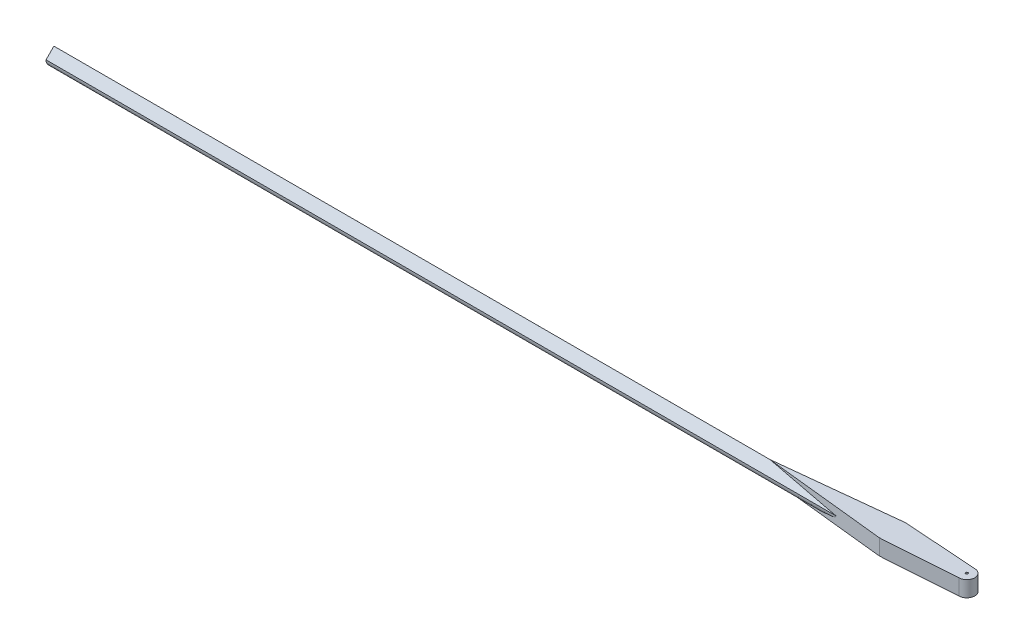
ISO-10303-21;
HEADER;
FILE_DESCRIPTION(('STEP AP214'),'2;1');
FILE_NAME('part.step','',(''),(''),'','','');
FILE_SCHEMA(('AUTOMOTIVE_DESIGN { 1 0 10303 214 1 1 1 1 }'));
ENDSEC;
DATA;
#1=APPLICATION_CONTEXT('core data for automotive mechanical design processes');
#2=APPLICATION_PROTOCOL_DEFINITION('international standard','automotive_design',2000,#1);
#3=PRODUCT_CONTEXT('',#1,'mechanical');
#4=PRODUCT('Part','Part','',(#3));
#5=PRODUCT_RELATED_PRODUCT_CATEGORY('part','',(#4));
#6=PRODUCT_DEFINITION_FORMATION('','',#4);
#7=PRODUCT_DEFINITION_CONTEXT('part definition',#1,'design');
#8=PRODUCT_DEFINITION('design','',#6,#7);
#9=PRODUCT_DEFINITION_SHAPE('','',#8);
#10=(LENGTH_UNIT() NAMED_UNIT(*) SI_UNIT(.MILLI.,.METRE.));
#11=(NAMED_UNIT(*) PLANE_ANGLE_UNIT() SI_UNIT($,.RADIAN.));
#12=(NAMED_UNIT(*) SI_UNIT($,.STERADIAN.) SOLID_ANGLE_UNIT());
#13=UNCERTAINTY_MEASURE_WITH_UNIT(LENGTH_MEASURE(1.E-05),#10,'distance_accuracy_value','');
#14=(GEOMETRIC_REPRESENTATION_CONTEXT(3) GLOBAL_UNCERTAINTY_ASSIGNED_CONTEXT((#13)) GLOBAL_UNIT_ASSIGNED_CONTEXT((#10,
#11,#12)) REPRESENTATION_CONTEXT('',''));
#15=CARTESIAN_POINT('',(0.,0.,0.));
#16=DIRECTION('',(0.,0.,1.));
#17=DIRECTION('',(1.,0.,0.));
#18=AXIS2_PLACEMENT_3D('',#15,#16,#17);
#19=CARTESIAN_POINT('',(655.434048607067,10.,0.));
#20=DIRECTION('',(0.,-1.,0.));
#21=DIRECTION('',(0.,0.,-1.));
#22=AXIS2_PLACEMENT_3D('',#19,#20,#21);
#23=PLANE('',#22);
#24=DIRECTION('',(-0.994357217076974,0.,0.10608357482163));
#25=VECTOR('',#24,1.);
#26=CARTESIAN_POINT('',(500.000000000001,10.,-10.001696369637));
#27=LINE('',#26,#25);
#28=CARTESIAN_POINT('',(561.410175265687,10.,-16.5532764363631));
#29=VERTEX_POINT('',#28);
#30=CARTESIAN_POINT('',(406.266618677878,10.,-0.00169636963684265));
#31=VERTEX_POINT('',#30);
#32=EDGE_CURVE('E244',#29,#31,#27,.T.);
#33=ORIENTED_EDGE('',*,*,#32,.T.);
#34=DIRECTION('',(-1.,0.,0.));
#35=VECTOR('',#34,1.);
#36=CARTESIAN_POINT('',(655.434048607067,10.,-0.00169636963684439));
#37=LINE('',#36,#35);
#38=CARTESIAN_POINT('',(-499.999999999999,10.,-0.00169636963684439));
#39=VERTEX_POINT('',#38);
#40=EDGE_CURVE('E150',#31,#39,#37,.T.);
#41=ORIENTED_EDGE('',*,*,#40,.T.);
#42=DIRECTION('',(0.,0.,1.));
#43=VECTOR('',#42,1.);
#44=CARTESIAN_POINT('',(-499.999999999999,10.,-10.001696369637));
#45=LINE('',#44,#43);
#46=CARTESIAN_POINT('',(-499.999999999999,10.,0.00169636963684439));
#47=VERTEX_POINT('',#46);
#48=EDGE_CURVE('E217',#39,#47,#45,.T.);
#49=ORIENTED_EDGE('',*,*,#48,.T.);
#50=DIRECTION('',(1.,0.,0.));
#51=VECTOR('',#50,1.);
#52=CARTESIAN_POINT('',(655.434048607067,10.,0.00169636963684439));
#53=LINE('',#52,#51);
#54=CARTESIAN_POINT('',(406.266618677878,10.,0.00169636963684265));
#55=VERTEX_POINT('',#54);
#56=EDGE_CURVE('E137',#47,#55,#53,.T.);
#57=ORIENTED_EDGE('',*,*,#56,.T.);
#58=DIRECTION('',(0.994357217076974,0.,0.10608357482163));
#59=VECTOR('',#58,1.);
#60=CARTESIAN_POINT('',(500.000000000001,10.,10.001696369637));
#61=LINE('',#60,#59);
#62=CARTESIAN_POINT('',(561.410175265687,10.,16.5532764363631));
#63=VERTEX_POINT('',#62);
#64=EDGE_CURVE('E131',#55,#63,#61,.T.);
#65=ORIENTED_EDGE('',*,*,#64,.T.);
#66=DIRECTION('',(0.997581155940313,0.,-0.0695114185784537));
#67=VECTOR('',#66,1.);
#68=CARTESIAN_POINT('',(561.410175265687,10.,16.5532764363631));
#69=LINE('',#68,#67);
#70=CARTESIAN_POINT('',(655.434048607067,10.,10.001696369637));
#71=VERTEX_POINT('',#70);
#72=EDGE_CURVE('E120',#63,#71,#69,.T.);
#73=ORIENTED_EDGE('',*,*,#72,.T.);
#74=CARTESIAN_POINT('',(655.434048607067,10.,0.));
#75=DIRECTION('',(0.,1.,0.));
#76=DIRECTION('',(0.,0.,-1.));
#77=AXIS2_PLACEMENT_3D('',#74,#75,#76);
#78=CIRCLE('',#77,10.001696369637);
#79=CARTESIAN_POINT('',(655.434048607067,10.,-10.001696369637));
#80=VERTEX_POINT('',#79);
#81=EDGE_CURVE('E130',#71,#80,#78,.T.);
#82=ORIENTED_EDGE('',*,*,#81,.T.);
#83=DIRECTION('',(-0.997581155940313,0.,-0.0695114185784537));
#84=VECTOR('',#83,1.);
#85=CARTESIAN_POINT('',(561.410175265687,10.,-16.5532764363631));
#86=LINE('',#85,#84);
#87=EDGE_CURVE('E227',#80,#29,#86,.T.);
#88=ORIENTED_EDGE('',*,*,#87,.T.);
#89=EDGE_LOOP('',(#33,#41,#49,#57,#65,#73,#82,#88));
#90=FACE_BOUND('',#89,.T.);
#91=CARTESIAN_POINT('',(655.434048607067,10.,0.));
#92=DIRECTION('',(0.,1.,0.));
#93=DIRECTION('',(0.,0.,1.));
#94=AXIS2_PLACEMENT_3D('',#91,#92,#93);
#95=CIRCLE('',#94,1.49999999999997);
#96=CARTESIAN_POINT('',(655.434048607067,10.,1.49999999999997));
#97=VERTEX_POINT('',#96);
#98=EDGE_CURVE('E241',#97,#97,#95,.T.);
#99=ORIENTED_EDGE('',*,*,#98,.F.);
#100=EDGE_LOOP('',(#99));
#101=FACE_BOUND('',#100,.T.);
#102=ADVANCED_FACE('F42',(#90,#101),#23,.F.);
#103=CARTESIAN_POINT('',(655.434048607067,-10.,0.));
#104=DIRECTION('',(0.,-1.,0.));
#105=DIRECTION('',(0.,0.,-1.));
#106=AXIS2_PLACEMENT_3D('',#103,#104,#105);
#107=PLANE('',#106);
#108=DIRECTION('',(0.994357217076974,0.,0.10608357482163));
#109=VECTOR('',#108,1.);
#110=CARTESIAN_POINT('',(500.000000000001,-10.,10.001696369637));
#111=LINE('',#110,#109);
#112=CARTESIAN_POINT('',(406.266618677879,-10.,0.00169636963696408));
#113=VERTEX_POINT('',#112);
#114=CARTESIAN_POINT('',(561.410175265687,-10.,16.5532764363631));
#115=VERTEX_POINT('',#114);
#116=EDGE_CURVE('E58',#113,#115,#111,.T.);
#117=ORIENTED_EDGE('',*,*,#116,.F.);
#118=DIRECTION('',(1.,0.,0.));
#119=VECTOR('',#118,1.);
#120=CARTESIAN_POINT('',(-499.999999999999,-10.,0.00169636963696408));
#121=LINE('',#120,#119);
#122=CARTESIAN_POINT('',(-499.999999999999,-10.,0.00169636963696408));
#123=VERTEX_POINT('',#122);
#124=EDGE_CURVE('E184',#113,#123,#121,.F.);
#125=ORIENTED_EDGE('',*,*,#124,.T.);
#126=DIRECTION('',(0.,0.,1.));
#127=VECTOR('',#126,1.);
#128=CARTESIAN_POINT('',(-499.999999999999,-10.,-10.001696369637));
#129=LINE('',#128,#127);
#130=CARTESIAN_POINT('',(-499.999999999999,-10.,-0.00169636963696408));
#131=VERTEX_POINT('',#130);
#132=EDGE_CURVE('E142',#131,#123,#129,.T.);
#133=ORIENTED_EDGE('',*,*,#132,.F.);
#134=DIRECTION('',(-1.,0.,0.));
#135=VECTOR('',#134,1.);
#136=CARTESIAN_POINT('',(500.000000000001,-10.,-0.00169636963696408));
#137=LINE('',#136,#135);
#138=CARTESIAN_POINT('',(406.266618677879,-10.,-0.00169636963696235));
#139=VERTEX_POINT('',#138);
#140=EDGE_CURVE('E181',#131,#139,#137,.F.);
#141=ORIENTED_EDGE('',*,*,#140,.T.);
#142=DIRECTION('',(-0.994357217076974,0.,0.10608357482163));
#143=VECTOR('',#142,1.);
#144=CARTESIAN_POINT('',(500.000000000001,-10.,-10.001696369637));
#145=LINE('',#144,#143);
#146=CARTESIAN_POINT('',(561.410175265687,-10.,-16.5532764363631));
#147=VERTEX_POINT('',#146);
#148=EDGE_CURVE('E65',#147,#139,#145,.T.);
#149=ORIENTED_EDGE('',*,*,#148,.F.);
#150=DIRECTION('',(-0.997581155940313,0.,-0.0695114185784537));
#151=VECTOR('',#150,1.);
#152=CARTESIAN_POINT('',(561.410175265687,-10.,-16.5532764363631));
#153=LINE('',#152,#151);
#154=CARTESIAN_POINT('',(655.434048607067,-10.,-10.001696369637));
#155=VERTEX_POINT('',#154);
#156=EDGE_CURVE('E211',#155,#147,#153,.T.);
#157=ORIENTED_EDGE('',*,*,#156,.F.);
#158=CARTESIAN_POINT('',(655.434048607067,-10.,0.));
#159=DIRECTION('',(0.,1.,0.));
#160=DIRECTION('',(0.,0.,-1.));
#161=AXIS2_PLACEMENT_3D('',#158,#159,#160);
#162=CIRCLE('',#161,10.001696369637);
#163=CARTESIAN_POINT('',(655.434048607067,-10.,10.001696369637));
#164=VERTEX_POINT('',#163);
#165=EDGE_CURVE('E230',#164,#155,#162,.T.);
#166=ORIENTED_EDGE('',*,*,#165,.F.);
#167=DIRECTION('',(0.997581155940313,0.,-0.0695114185784537));
#168=VECTOR('',#167,1.);
#169=CARTESIAN_POINT('',(561.410175265687,-10.,16.5532764363631));
#170=LINE('',#169,#168);
#171=EDGE_CURVE('E234',#115,#164,#170,.T.);
#172=ORIENTED_EDGE('',*,*,#171,.F.);
#173=EDGE_LOOP('',(#117,#125,#133,#141,#149,#157,#166,#172));
#174=FACE_BOUND('',#173,.T.);
#175=CARTESIAN_POINT('',(655.434048607067,-10.,0.));
#176=DIRECTION('',(0.,1.,0.));
#177=DIRECTION('',(0.,0.,1.));
#178=AXIS2_PLACEMENT_3D('',#175,#176,#177);
#179=CIRCLE('',#178,1.49999999999997);
#180=CARTESIAN_POINT('',(655.434048607067,-10.,1.49999999999997));
#181=VERTEX_POINT('',#180);
#182=EDGE_CURVE('E251',#181,#181,#179,.T.);
#183=ORIENTED_EDGE('',*,*,#182,.T.);
#184=EDGE_LOOP('',(#183));
#185=FACE_BOUND('',#184,.T.);
#186=ADVANCED_FACE('F201',(#174,#185),#107,.T.);
#187=CARTESIAN_POINT('',(500.000000000001,10.,10.001696369637));
#188=DIRECTION('',(0.10608357482163,0.,-0.994357217076974));
#189=DIRECTION('',(-0.994357217076974,0.,-0.10608357482163));
#190=AXIS2_PLACEMENT_3D('',#187,#188,#189);
#191=PLANE('',#190);
#192=ORIENTED_EDGE('',*,*,#116,.T.);
#193=DIRECTION('',(0.,-1.,0.));
#194=VECTOR('',#193,1.);
#195=CARTESIAN_POINT('',(561.410175265687,10.,16.5532764363631));
#196=LINE('',#195,#194);
#197=EDGE_CURVE('E124',#63,#115,#196,.T.);
#198=ORIENTED_EDGE('',*,*,#197,.F.);
#199=ORIENTED_EDGE('',*,*,#64,.F.);
#200=DIRECTION('',(-0.988808891640767,0.105491648513421,-0.10549164851342));
#201=VECTOR('',#200,1.);
#202=CARTESIAN_POINT('',(498.956889199562,0.111284879060565,9.89041149057617));
#203=LINE('',#202,#201);
#204=CARTESIAN_POINT('',(500.000000000001,-2.28983498828939E-13,10.001696369637));
#205=VERTEX_POINT('',#204);
#206=EDGE_CURVE('E178',#55,#205,#203,.F.);
#207=ORIENTED_EDGE('',*,*,#206,.T.);
#208=CARTESIAN_POINT('',(406.266618677879,0.,0.00169636963696408));
#209=DIRECTION('',(0.10608357482163,0.,-0.994357217076974));
#210=DIRECTION('',(-0.994357217076974,0.,-0.10608357482163));
#211=AXIS2_PLACEMENT_3D('',#208,#209,#210);
#212=ELLIPSE('',#211,94.2652999468964,10.);
#213=EDGE_CURVE('E51',#205,#113,#212,.T.);
#214=ORIENTED_EDGE('',*,*,#213,.T.);
#215=EDGE_LOOP('',(#192,#198,#199,#207,#214));
#216=FACE_BOUND('',#215,.T.);
#217=ADVANCED_FACE('F144',(#216),#191,.F.);
#218=CARTESIAN_POINT('',(561.410175265687,10.,16.5532764363631));
#219=DIRECTION('',(-0.0695114185784537,0.,-0.997581155940313));
#220=DIRECTION('',(-0.997581155940313,0.,0.0695114185784537));
#221=AXIS2_PLACEMENT_3D('',#218,#219,#220);
#222=PLANE('',#221);
#223=ORIENTED_EDGE('',*,*,#171,.T.);
#224=DIRECTION('',(0.,-1.,0.));
#225=VECTOR('',#224,1.);
#226=CARTESIAN_POINT('',(655.434048607067,10.,10.001696369637));
#227=LINE('',#226,#225);
#228=EDGE_CURVE('E126',#71,#164,#227,.T.);
#229=ORIENTED_EDGE('',*,*,#228,.F.);
#230=ORIENTED_EDGE('',*,*,#72,.F.);
#231=ORIENTED_EDGE('',*,*,#197,.T.);
#232=EDGE_LOOP('',(#223,#229,#230,#231));
#233=FACE_BOUND('',#232,.T.);
#234=ADVANCED_FACE('F122',(#233),#222,.F.);
#235=CARTESIAN_POINT('',(655.434048607067,10.,0.));
#236=DIRECTION('',(0.,-1.,0.));
#237=DIRECTION('',(0.,0.,-1.));
#238=AXIS2_PLACEMENT_3D('',#235,#236,#237);
#239=CYLINDRICAL_SURFACE('',#238,10.001696369637);
#240=ORIENTED_EDGE('',*,*,#165,.T.);
#241=DIRECTION('',(0.,-1.,0.));
#242=VECTOR('',#241,1.);
#243=CARTESIAN_POINT('',(655.434048607067,10.,-10.001696369637));
#244=LINE('',#243,#242);
#245=EDGE_CURVE('E152',#80,#155,#244,.T.);
#246=ORIENTED_EDGE('',*,*,#245,.F.);
#247=ORIENTED_EDGE('',*,*,#81,.F.);
#248=ORIENTED_EDGE('',*,*,#228,.T.);
#249=EDGE_LOOP('',(#240,#246,#247,#248));
#250=FACE_BOUND('',#249,.T.);
#251=ADVANCED_FACE('F277',(#250),#239,.T.);
#252=CARTESIAN_POINT('',(561.410175265687,10.,-16.5532764363631));
#253=DIRECTION('',(-0.0695114185784537,0.,0.997581155940313));
#254=DIRECTION('',(0.997581155940313,0.,0.0695114185784537));
#255=AXIS2_PLACEMENT_3D('',#252,#253,#254);
#256=PLANE('',#255);
#257=ORIENTED_EDGE('',*,*,#156,.T.);
#258=DIRECTION('',(0.,-1.,0.));
#259=VECTOR('',#258,1.);
#260=CARTESIAN_POINT('',(561.410175265687,10.,-16.5532764363631));
#261=LINE('',#260,#259);
#262=EDGE_CURVE('E215',#29,#147,#261,.T.);
#263=ORIENTED_EDGE('',*,*,#262,.F.);
#264=ORIENTED_EDGE('',*,*,#87,.F.);
#265=ORIENTED_EDGE('',*,*,#245,.T.);
#266=EDGE_LOOP('',(#257,#263,#264,#265));
#267=FACE_BOUND('',#266,.T.);
#268=ADVANCED_FACE('F225',(#267),#256,.F.);
#269=CARTESIAN_POINT('',(500.000000000001,10.,-10.001696369637));
#270=DIRECTION('',(0.10608357482163,0.,0.994357217076974));
#271=DIRECTION('',(0.994357217076974,0.,-0.10608357482163));
#272=AXIS2_PLACEMENT_3D('',#269,#270,#271);
#273=PLANE('',#272);
#274=ORIENTED_EDGE('',*,*,#148,.T.);
#275=CARTESIAN_POINT('',(406.266618677879,0.,-0.00169636963696408));
#276=DIRECTION('',(0.10608357482163,0.,0.994357217076974));
#277=DIRECTION('',(0.994357217076974,0.,-0.10608357482163));
#278=AXIS2_PLACEMENT_3D('',#275,#276,#277);
#279=ELLIPSE('',#278,94.2652999468964,10.);
#280=CARTESIAN_POINT('',(500.000000000001,-2.28983498828939E-13,-10.001696369637));
#281=VERTEX_POINT('',#280);
#282=EDGE_CURVE('E11',#139,#281,#279,.T.);
#283=ORIENTED_EDGE('',*,*,#282,.T.);
#284=DIRECTION('',(0.988808891640767,-0.105491648513421,-0.10549164851342));
#285=VECTOR('',#284,1.);
#286=CARTESIAN_POINT('',(498.956889199562,0.111284879060565,-9.89041149057617));
#287=LINE('',#286,#285);
#288=EDGE_CURVE('E174',#281,#31,#287,.F.);
#289=ORIENTED_EDGE('',*,*,#288,.T.);
#290=ORIENTED_EDGE('',*,*,#32,.F.);
#291=ORIENTED_EDGE('',*,*,#262,.T.);
#292=EDGE_LOOP('',(#274,#283,#289,#290,#291));
#293=FACE_BOUND('',#292,.T.);
#294=ADVANCED_FACE('F272',(#293),#273,.F.);
#295=CARTESIAN_POINT('',(-499.999999999999,10.,-10.001696369637));
#296=DIRECTION('',(1.,0.,0.));
#297=DIRECTION('',(0.,0.,-1.));
#298=AXIS2_PLACEMENT_3D('',#295,#296,#297);
#299=PLANE('',#298);
#300=ORIENTED_EDGE('',*,*,#132,.T.);
#301=CARTESIAN_POINT('',(-499.999999999999,0.,0.00169636963696408));
#302=DIRECTION('',(1.,0.,0.));
#303=DIRECTION('',(0.,0.,-1.));
#304=AXIS2_PLACEMENT_3D('',#301,#302,#303);
#305=CIRCLE('',#304,10.);
#306=CARTESIAN_POINT('',(-499.999999999999,-2.28983498828939E-13,10.001696369637));
#307=VERTEX_POINT('',#306);
#308=EDGE_CURVE('E190',#123,#307,#305,.F.);
#309=ORIENTED_EDGE('',*,*,#308,.T.);
#310=DIRECTION('',(0.,-0.707106781186551,0.707106781186544));
#311=VECTOR('',#310,1.);
#312=CARTESIAN_POINT('',(-499.999999999999,10.,0.00169636963684439));
#313=LINE('',#312,#311);
#314=EDGE_CURVE('E159',#307,#47,#313,.F.);
#315=ORIENTED_EDGE('',*,*,#314,.T.);
#316=ORIENTED_EDGE('',*,*,#48,.F.);
#317=DIRECTION('',(0.,0.707106781186551,0.707106781186544));
#318=VECTOR('',#317,1.);
#319=CARTESIAN_POINT('',(-499.999999999999,10.,-0.00169636963684439));
#320=LINE('',#319,#318);
#321=CARTESIAN_POINT('',(-499.999999999999,-2.28983498828939E-13,-10.001696369637));
#322=VERTEX_POINT('',#321);
#323=EDGE_CURVE('E162',#39,#322,#320,.F.);
#324=ORIENTED_EDGE('',*,*,#323,.T.);
#325=CARTESIAN_POINT('',(-499.999999999999,0.,-0.00169636963696408));
#326=DIRECTION('',(1.,0.,0.));
#327=DIRECTION('',(0.,0.,-1.));
#328=AXIS2_PLACEMENT_3D('',#325,#326,#327);
#329=CIRCLE('',#328,10.);
#330=EDGE_CURVE('E187',#322,#131,#329,.F.);
#331=ORIENTED_EDGE('',*,*,#330,.T.);
#332=EDGE_LOOP('',(#300,#309,#315,#316,#324,#331));
#333=FACE_BOUND('',#332,.T.);
#334=ADVANCED_FACE('F205',(#333),#299,.F.);
#335=CARTESIAN_POINT('',(655.434048607067,10.,0.));
#336=DIRECTION('',(0.,-1.,0.));
#337=DIRECTION('',(0.,0.,-1.));
#338=AXIS2_PLACEMENT_3D('',#335,#336,#337);
#339=CYLINDRICAL_SURFACE('',#338,1.49999999999997);
#340=ORIENTED_EDGE('',*,*,#98,.T.);
#341=EDGE_LOOP('',(#340));
#342=FACE_BOUND('',#341,.T.);
#343=ORIENTED_EDGE('',*,*,#182,.F.);
#344=EDGE_LOOP('',(#343));
#345=FACE_BOUND('',#344,.T.);
#346=ADVANCED_FACE('F260',(#342,#345),#339,.F.);
#347=CARTESIAN_POINT('',(655.434048607067,10.,-0.00169636963684439));
#348=DIRECTION('',(0.,-0.707106781186544,0.707106781186551));
#349=DIRECTION('',(-1.,0.,0.));
#350=AXIS2_PLACEMENT_3D('',#347,#348,#349);
#351=PLANE('',#350);
#352=ORIENTED_EDGE('',*,*,#288,.F.);
#353=DIRECTION('',(1.,0.,0.));
#354=VECTOR('',#353,1.);
#355=CARTESIAN_POINT('',(-499.999999999999,-2.28983498828939E-13,-10.001696369637));
#356=LINE('',#355,#354);
#357=EDGE_CURVE('E166',#322,#281,#356,.T.);
#358=ORIENTED_EDGE('',*,*,#357,.F.);
#359=ORIENTED_EDGE('',*,*,#323,.F.);
#360=ORIENTED_EDGE('',*,*,#40,.F.);
#361=EDGE_LOOP('',(#352,#358,#359,#360));
#362=FACE_BOUND('',#361,.T.);
#363=ADVANCED_FACE('F285',(#362),#351,.F.);
#364=CARTESIAN_POINT('',(655.434048607067,10.,0.00169636963684439));
#365=DIRECTION('',(0.,-0.707106781186544,-0.707106781186551));
#366=DIRECTION('',(1.,0.,0.));
#367=AXIS2_PLACEMENT_3D('',#364,#365,#366);
#368=PLANE('',#367);
#369=ORIENTED_EDGE('',*,*,#314,.F.);
#370=DIRECTION('',(-1.,0.,0.));
#371=VECTOR('',#370,1.);
#372=CARTESIAN_POINT('',(-499.999999999999,-2.28983498828939E-13,10.001696369637));
#373=LINE('',#372,#371);
#374=EDGE_CURVE('E170',#205,#307,#373,.T.);
#375=ORIENTED_EDGE('',*,*,#374,.F.);
#376=ORIENTED_EDGE('',*,*,#206,.F.);
#377=ORIENTED_EDGE('',*,*,#56,.F.);
#378=EDGE_LOOP('',(#369,#375,#376,#377));
#379=FACE_BOUND('',#378,.T.);
#380=ADVANCED_FACE('F291',(#379),#368,.F.);
#381=CARTESIAN_POINT('',(-499.999999999999,0.,0.00169636963696408));
#382=DIRECTION('',(-1.,0.,0.));
#383=DIRECTION('',(0.,0.,1.));
#384=AXIS2_PLACEMENT_3D('',#381,#382,#383);
#385=CYLINDRICAL_SURFACE('',#384,10.);
#386=ORIENTED_EDGE('',*,*,#308,.F.);
#387=ORIENTED_EDGE('',*,*,#124,.F.);
#388=ORIENTED_EDGE('',*,*,#213,.F.);
#389=ORIENTED_EDGE('',*,*,#374,.T.);
#390=EDGE_LOOP('',(#386,#387,#388,#389));
#391=FACE_BOUND('',#390,.T.);
#392=ADVANCED_FACE('F198',(#391),#385,.T.);
#393=CARTESIAN_POINT('',(-499.999999999999,0.,-0.00169636963696408));
#394=DIRECTION('',(1.,0.,0.));
#395=DIRECTION('',(0.,0.,-1.));
#396=AXIS2_PLACEMENT_3D('',#393,#394,#395);
#397=CYLINDRICAL_SURFACE('',#396,10.);
#398=ORIENTED_EDGE('',*,*,#282,.F.);
#399=ORIENTED_EDGE('',*,*,#140,.F.);
#400=ORIENTED_EDGE('',*,*,#330,.F.);
#401=ORIENTED_EDGE('',*,*,#357,.T.);
#402=EDGE_LOOP('',(#398,#399,#400,#401));
#403=FACE_BOUND('',#402,.T.);
#404=ADVANCED_FACE('F44',(#403),#397,.T.);
#405=CLOSED_SHELL('',(#102,#186,#217,#234,#251,#268,#294,#334,#346,#363,#380,#392,#404));
#406=MANIFOLD_SOLID_BREP('B2',#405);
#407=ADVANCED_BREP_SHAPE_REPRESENTATION('',(#18,#406),#14);
#408=SHAPE_DEFINITION_REPRESENTATION(#9,#407);
ENDSEC;
END-ISO-10303-21;
